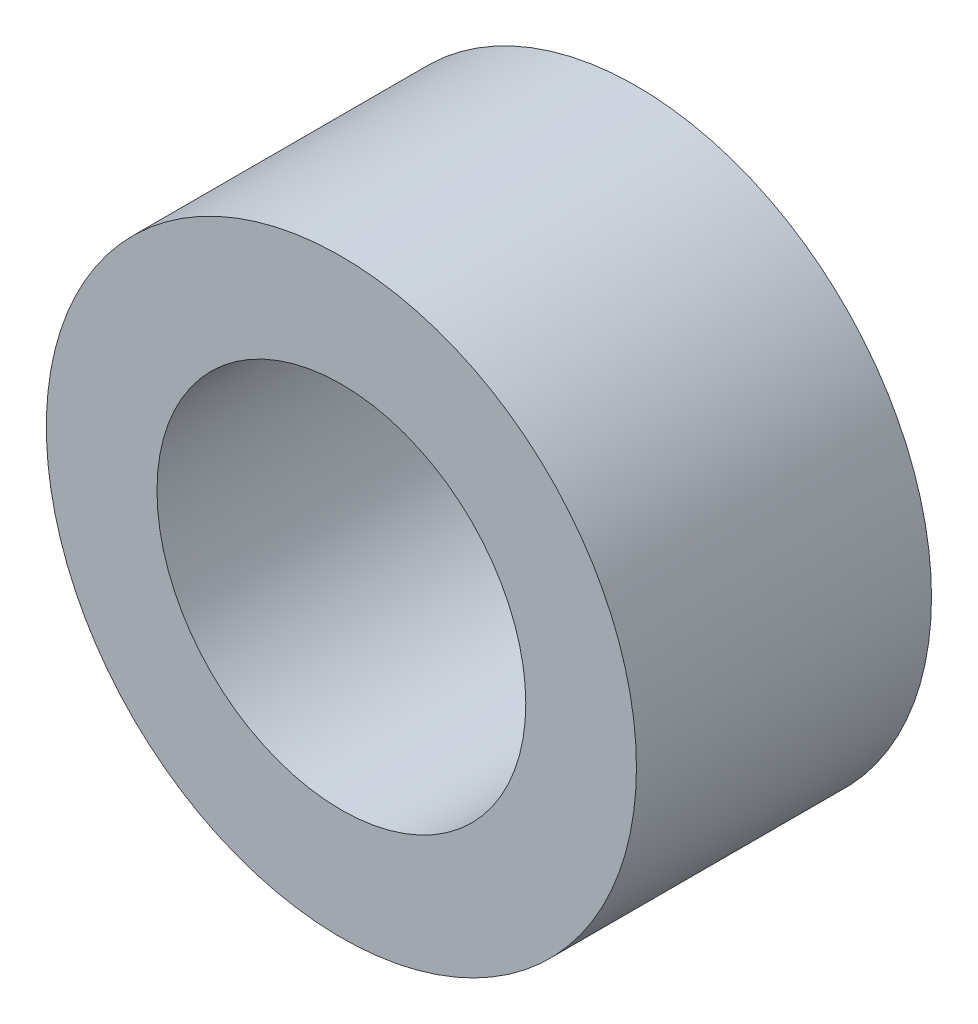
ISO-10303-21;
HEADER;
FILE_DESCRIPTION(('STEP AP214'),'2;1');
FILE_NAME('part.step','',(''),(''),'','','');
FILE_SCHEMA(('AUTOMOTIVE_DESIGN { 1 0 10303 214 1 1 1 1 }'));
ENDSEC;
DATA;
#1=APPLICATION_CONTEXT('core data for automotive mechanical design processes');
#2=APPLICATION_PROTOCOL_DEFINITION('international standard','automotive_design',2000,#1);
#3=PRODUCT_CONTEXT('',#1,'mechanical');
#4=PRODUCT('Part','Part','',(#3));
#5=PRODUCT_RELATED_PRODUCT_CATEGORY('part','',(#4));
#6=PRODUCT_DEFINITION_FORMATION('','',#4);
#7=PRODUCT_DEFINITION_CONTEXT('part definition',#1,'design');
#8=PRODUCT_DEFINITION('design','',#6,#7);
#9=PRODUCT_DEFINITION_SHAPE('','',#8);
#10=(LENGTH_UNIT() NAMED_UNIT(*) SI_UNIT(.MILLI.,.METRE.));
#11=(NAMED_UNIT(*) PLANE_ANGLE_UNIT() SI_UNIT($,.RADIAN.));
#12=(NAMED_UNIT(*) SI_UNIT($,.STERADIAN.) SOLID_ANGLE_UNIT());
#13=UNCERTAINTY_MEASURE_WITH_UNIT(LENGTH_MEASURE(1.E-05),#10,'distance_accuracy_value','');
#14=(GEOMETRIC_REPRESENTATION_CONTEXT(3) GLOBAL_UNCERTAINTY_ASSIGNED_CONTEXT((#13)) GLOBAL_UNIT_ASSIGNED_CONTEXT((#10,
#11,#12)) REPRESENTATION_CONTEXT('',''));
#15=CARTESIAN_POINT('',(0.,0.,0.));
#16=DIRECTION('',(0.,0.,1.));
#17=DIRECTION('',(1.,0.,0.));
#18=AXIS2_PLACEMENT_3D('',#15,#16,#17);
#19=CARTESIAN_POINT('',(0.,0.,5.));
#20=DIRECTION('',(0.,0.,1.));
#21=DIRECTION('',(1.,0.,0.));
#22=AXIS2_PLACEMENT_3D('',#19,#20,#21);
#23=PLANE('',#22);
#24=CARTESIAN_POINT('',(0.,0.,5.));
#25=DIRECTION('',(0.,0.,1.));
#26=DIRECTION('',(1.,0.,0.));
#27=AXIS2_PLACEMENT_3D('',#24,#25,#26);
#28=CIRCLE('',#27,5.);
#29=CARTESIAN_POINT('',(5.,0.,5.));
#30=VERTEX_POINT('',#29);
#31=EDGE_CURVE('E10',#30,#30,#28,.T.);
#32=ORIENTED_EDGE('',*,*,#31,.T.);
#33=EDGE_LOOP('',(#32));
#34=FACE_BOUND('',#33,.T.);
#35=CARTESIAN_POINT('',(0.,0.,5.));
#36=DIRECTION('',(0.,0.,1.));
#37=DIRECTION('',(1.,0.,0.));
#38=AXIS2_PLACEMENT_3D('',#35,#36,#37);
#39=CIRCLE('',#38,3.125);
#40=CARTESIAN_POINT('',(3.125,0.,5.));
#41=VERTEX_POINT('',#40);
#42=EDGE_CURVE('E50',#41,#41,#39,.T.);
#43=ORIENTED_EDGE('',*,*,#42,.F.);
#44=EDGE_LOOP('',(#43));
#45=FACE_BOUND('',#44,.T.);
#46=ADVANCED_FACE('F39',(#34,#45),#23,.T.);
#47=CARTESIAN_POINT('',(0.,0.,0.));
#48=DIRECTION('',(0.,0.,1.));
#49=DIRECTION('',(1.,0.,0.));
#50=AXIS2_PLACEMENT_3D('',#47,#48,#49);
#51=PLANE('',#50);
#52=CARTESIAN_POINT('',(0.,0.,0.));
#53=DIRECTION('',(0.,0.,1.));
#54=DIRECTION('',(1.,0.,0.));
#55=AXIS2_PLACEMENT_3D('',#52,#53,#54);
#56=CIRCLE('',#55,5.);
#57=CARTESIAN_POINT('',(5.,0.,0.));
#58=VERTEX_POINT('',#57);
#59=EDGE_CURVE('E43',#58,#58,#56,.T.);
#60=ORIENTED_EDGE('',*,*,#59,.F.);
#61=EDGE_LOOP('',(#60));
#62=FACE_BOUND('',#61,.T.);
#63=CARTESIAN_POINT('',(0.,0.,0.));
#64=DIRECTION('',(0.,0.,1.));
#65=DIRECTION('',(1.,0.,0.));
#66=AXIS2_PLACEMENT_3D('',#63,#64,#65);
#67=CIRCLE('',#66,3.125);
#68=CARTESIAN_POINT('',(3.125,0.,0.));
#69=VERTEX_POINT('',#68);
#70=EDGE_CURVE('E52',#69,#69,#67,.T.);
#71=ORIENTED_EDGE('',*,*,#70,.T.);
#72=EDGE_LOOP('',(#71));
#73=FACE_BOUND('',#72,.T.);
#74=ADVANCED_FACE('F62',(#62,#73),#51,.F.);
#75=CARTESIAN_POINT('',(0.,0.,5.));
#76=DIRECTION('',(0.,0.,-1.));
#77=DIRECTION('',(-1.,0.,0.));
#78=AXIS2_PLACEMENT_3D('',#75,#76,#77);
#79=CYLINDRICAL_SURFACE('',#78,5.);
#80=ORIENTED_EDGE('',*,*,#31,.F.);
#81=EDGE_LOOP('',(#80));
#82=FACE_BOUND('',#81,.T.);
#83=ORIENTED_EDGE('',*,*,#59,.T.);
#84=EDGE_LOOP('',(#83));
#85=FACE_BOUND('',#84,.T.);
#86=ADVANCED_FACE('F41',(#82,#85),#79,.T.);
#87=CARTESIAN_POINT('',(0.,0.,5.));
#88=DIRECTION('',(0.,0.,-1.));
#89=DIRECTION('',(-1.,0.,0.));
#90=AXIS2_PLACEMENT_3D('',#87,#88,#89);
#91=CYLINDRICAL_SURFACE('',#90,3.125);
#92=ORIENTED_EDGE('',*,*,#42,.T.);
#93=EDGE_LOOP('',(#92));
#94=FACE_BOUND('',#93,.T.);
#95=ORIENTED_EDGE('',*,*,#70,.F.);
#96=EDGE_LOOP('',(#95));
#97=FACE_BOUND('',#96,.T.);
#98=ADVANCED_FACE('F58',(#94,#97),#91,.F.);
#99=CLOSED_SHELL('',(#46,#74,#86,#98));
#100=MANIFOLD_SOLID_BREP('B2',#99);
#101=ADVANCED_BREP_SHAPE_REPRESENTATION('',(#18,#100),#14);
#102=SHAPE_DEFINITION_REPRESENTATION(#9,#101);
ENDSEC;
END-ISO-10303-21;
